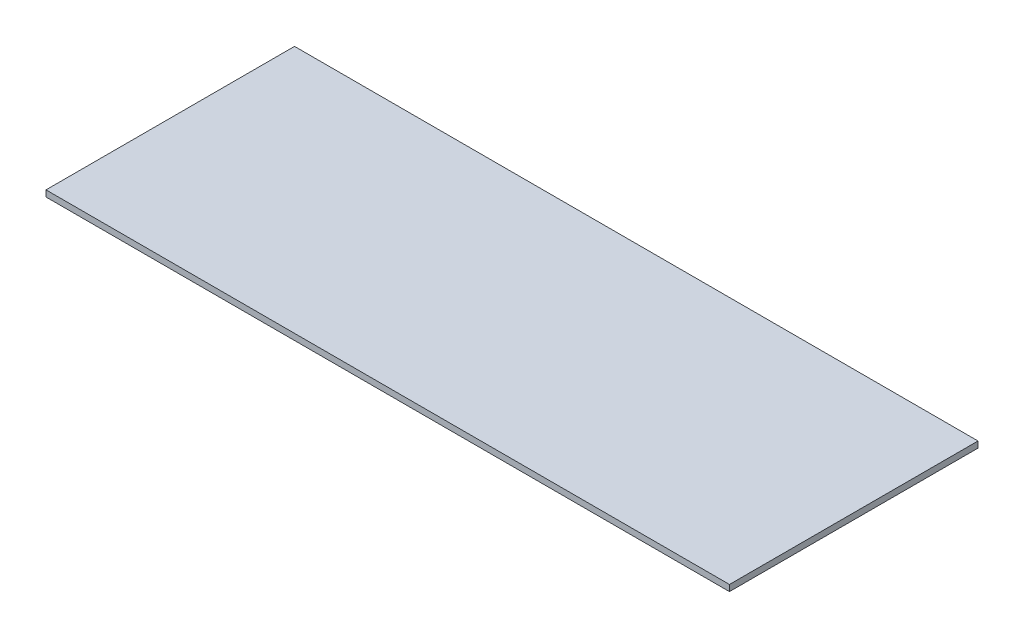
ISO-10303-21;
HEADER;
FILE_DESCRIPTION(('STEP AP214'),'2;1');
FILE_NAME('part.step','',(''),(''),'','','');
FILE_SCHEMA(('AUTOMOTIVE_DESIGN { 1 0 10303 214 1 1 1 1 }'));
ENDSEC;
DATA;
#1=APPLICATION_CONTEXT('core data for automotive mechanical design processes');
#2=APPLICATION_PROTOCOL_DEFINITION('international standard','automotive_design',2000,#1);
#3=PRODUCT_CONTEXT('',#1,'mechanical');
#4=PRODUCT('Part','Part','',(#3));
#5=PRODUCT_RELATED_PRODUCT_CATEGORY('part','',(#4));
#6=PRODUCT_DEFINITION_FORMATION('','',#4);
#7=PRODUCT_DEFINITION_CONTEXT('part definition',#1,'design');
#8=PRODUCT_DEFINITION('design','',#6,#7);
#9=PRODUCT_DEFINITION_SHAPE('','',#8);
#10=(LENGTH_UNIT() NAMED_UNIT(*) SI_UNIT(.MILLI.,.METRE.));
#11=(NAMED_UNIT(*) PLANE_ANGLE_UNIT() SI_UNIT($,.RADIAN.));
#12=(NAMED_UNIT(*) SI_UNIT($,.STERADIAN.) SOLID_ANGLE_UNIT());
#13=UNCERTAINTY_MEASURE_WITH_UNIT(LENGTH_MEASURE(1.E-05),#10,'distance_accuracy_value','');
#14=(GEOMETRIC_REPRESENTATION_CONTEXT(3) GLOBAL_UNCERTAINTY_ASSIGNED_CONTEXT((#13)) GLOBAL_UNIT_ASSIGNED_CONTEXT((#10,
#11,#12)) REPRESENTATION_CONTEXT('',''));
#15=CARTESIAN_POINT('',(0.,0.,0.));
#16=DIRECTION('',(0.,0.,1.));
#17=DIRECTION('',(1.,0.,0.));
#18=AXIS2_PLACEMENT_3D('',#15,#16,#17);
#19=CARTESIAN_POINT('',(0.,1.27,0.));
#20=DIRECTION('',(1.,0.,0.));
#21=DIRECTION('',(0.,0.,-1.));
#22=AXIS2_PLACEMENT_3D('',#19,#20,#21);
#23=PLANE('',#22);
#24=DIRECTION('',(0.,0.,1.));
#25=VECTOR('',#24,1.);
#26=CARTESIAN_POINT('',(0.,0.,0.));
#27=LINE('',#26,#25);
#28=CARTESIAN_POINT('',(0.,0.,-50.8));
#29=VERTEX_POINT('',#28);
#30=CARTESIAN_POINT('',(0.,0.,0.));
#31=VERTEX_POINT('',#30);
#32=EDGE_CURVE('E96',#29,#31,#27,.T.);
#33=ORIENTED_EDGE('',*,*,#32,.T.);
#34=DIRECTION('',(0.,-1.,0.));
#35=VECTOR('',#34,1.);
#36=CARTESIAN_POINT('',(0.,1.27,0.));
#37=LINE('',#36,#35);
#38=CARTESIAN_POINT('',(0.,1.27,0.));
#39=VERTEX_POINT('',#38);
#40=EDGE_CURVE('E11',#39,#31,#37,.T.);
#41=ORIENTED_EDGE('',*,*,#40,.F.);
#42=DIRECTION('',(0.,0.,1.));
#43=VECTOR('',#42,1.);
#44=CARTESIAN_POINT('',(0.,1.27,0.));
#45=LINE('',#44,#43);
#46=CARTESIAN_POINT('',(0.,1.27,-50.8));
#47=VERTEX_POINT('',#46);
#48=EDGE_CURVE('E84',#47,#39,#45,.T.);
#49=ORIENTED_EDGE('',*,*,#48,.F.);
#50=DIRECTION('',(0.,-1.,0.));
#51=VECTOR('',#50,1.);
#52=CARTESIAN_POINT('',(0.,1.27,-50.8));
#53=LINE('',#52,#51);
#54=EDGE_CURVE('E92',#47,#29,#53,.T.);
#55=ORIENTED_EDGE('',*,*,#54,.T.);
#56=EDGE_LOOP('',(#33,#41,#49,#55));
#57=FACE_BOUND('',#56,.T.);
#58=ADVANCED_FACE('F33',(#57),#23,.F.);
#59=CARTESIAN_POINT('',(0.,1.27,0.));
#60=DIRECTION('',(0.,0.,-1.));
#61=DIRECTION('',(-1.,0.,0.));
#62=AXIS2_PLACEMENT_3D('',#59,#60,#61);
#63=PLANE('',#62);
#64=DIRECTION('',(1.,0.,0.));
#65=VECTOR('',#64,1.);
#66=CARTESIAN_POINT('',(0.,0.,0.));
#67=LINE('',#66,#65);
#68=CARTESIAN_POINT('',(139.7,0.,0.));
#69=VERTEX_POINT('',#68);
#70=EDGE_CURVE('E88',#31,#69,#67,.T.);
#71=ORIENTED_EDGE('',*,*,#70,.T.);
#72=DIRECTION('',(0.,-1.,0.));
#73=VECTOR('',#72,1.);
#74=CARTESIAN_POINT('',(139.7,1.27,0.));
#75=LINE('',#74,#73);
#76=CARTESIAN_POINT('',(139.7,1.27,0.));
#77=VERTEX_POINT('',#76);
#78=EDGE_CURVE('E41',#77,#69,#75,.T.);
#79=ORIENTED_EDGE('',*,*,#78,.F.);
#80=DIRECTION('',(1.,0.,0.));
#81=VECTOR('',#80,1.);
#82=CARTESIAN_POINT('',(0.,1.27,0.));
#83=LINE('',#82,#81);
#84=EDGE_CURVE('E79',#39,#77,#83,.T.);
#85=ORIENTED_EDGE('',*,*,#84,.F.);
#86=ORIENTED_EDGE('',*,*,#40,.T.);
#87=EDGE_LOOP('',(#71,#79,#85,#86));
#88=FACE_BOUND('',#87,.T.);
#89=ADVANCED_FACE('F87',(#88),#63,.F.);
#90=CARTESIAN_POINT('',(139.7,1.27,0.));
#91=DIRECTION('',(-1.,0.,0.));
#92=DIRECTION('',(0.,0.,1.));
#93=AXIS2_PLACEMENT_3D('',#90,#91,#92);
#94=PLANE('',#93);
#95=DIRECTION('',(0.,0.,-1.));
#96=VECTOR('',#95,1.);
#97=CARTESIAN_POINT('',(139.7,0.,0.));
#98=LINE('',#97,#96);
#99=CARTESIAN_POINT('',(139.7,0.,-50.8));
#100=VERTEX_POINT('',#99);
#101=EDGE_CURVE('E66',#69,#100,#98,.T.);
#102=ORIENTED_EDGE('',*,*,#101,.T.);
#103=DIRECTION('',(0.,-1.,0.));
#104=VECTOR('',#103,1.);
#105=CARTESIAN_POINT('',(139.7,1.27,-50.8));
#106=LINE('',#105,#104);
#107=CARTESIAN_POINT('',(139.7,1.27,-50.8));
#108=VERTEX_POINT('',#107);
#109=EDGE_CURVE('E89',#108,#100,#106,.T.);
#110=ORIENTED_EDGE('',*,*,#109,.F.);
#111=DIRECTION('',(0.,0.,-1.));
#112=VECTOR('',#111,1.);
#113=CARTESIAN_POINT('',(139.7,1.27,0.));
#114=LINE('',#113,#112);
#115=EDGE_CURVE('E82',#77,#108,#114,.T.);
#116=ORIENTED_EDGE('',*,*,#115,.F.);
#117=ORIENTED_EDGE('',*,*,#78,.T.);
#118=EDGE_LOOP('',(#102,#110,#116,#117));
#119=FACE_BOUND('',#118,.T.);
#120=ADVANCED_FACE('F90',(#119),#94,.F.);
#121=CARTESIAN_POINT('',(0.,1.27,-50.8));
#122=DIRECTION('',(0.,0.,1.));
#123=DIRECTION('',(1.,0.,0.));
#124=AXIS2_PLACEMENT_3D('',#121,#122,#123);
#125=PLANE('',#124);
#126=DIRECTION('',(-1.,0.,0.));
#127=VECTOR('',#126,1.);
#128=CARTESIAN_POINT('',(0.,0.,-50.8));
#129=LINE('',#128,#127);
#130=EDGE_CURVE('E72',#100,#29,#129,.T.);
#131=ORIENTED_EDGE('',*,*,#130,.T.);
#132=ORIENTED_EDGE('',*,*,#54,.F.);
#133=DIRECTION('',(-1.,0.,0.));
#134=VECTOR('',#133,1.);
#135=CARTESIAN_POINT('',(0.,1.27,-50.8));
#136=LINE('',#135,#134);
#137=EDGE_CURVE('E49',#108,#47,#136,.T.);
#138=ORIENTED_EDGE('',*,*,#137,.F.);
#139=ORIENTED_EDGE('',*,*,#109,.T.);
#140=EDGE_LOOP('',(#131,#132,#138,#139));
#141=FACE_BOUND('',#140,.T.);
#142=ADVANCED_FACE('F103',(#141),#125,.F.);
#143=CARTESIAN_POINT('',(0.,1.27,0.));
#144=DIRECTION('',(0.,-1.,0.));
#145=DIRECTION('',(0.,0.,-1.));
#146=AXIS2_PLACEMENT_3D('',#143,#144,#145);
#147=PLANE('',#146);
#148=ORIENTED_EDGE('',*,*,#48,.T.);
#149=ORIENTED_EDGE('',*,*,#84,.T.);
#150=ORIENTED_EDGE('',*,*,#115,.T.);
#151=ORIENTED_EDGE('',*,*,#137,.T.);
#152=EDGE_LOOP('',(#148,#149,#150,#151));
#153=FACE_BOUND('',#152,.T.);
#154=ADVANCED_FACE('F80',(#153),#147,.F.);
#155=CARTESIAN_POINT('',(0.,0.,0.));
#156=DIRECTION('',(0.,-1.,0.));
#157=DIRECTION('',(0.,0.,-1.));
#158=AXIS2_PLACEMENT_3D('',#155,#156,#157);
#159=PLANE('',#158);
#160=ORIENTED_EDGE('',*,*,#32,.F.);
#161=ORIENTED_EDGE('',*,*,#130,.F.);
#162=ORIENTED_EDGE('',*,*,#101,.F.);
#163=ORIENTED_EDGE('',*,*,#70,.F.);
#164=EDGE_LOOP('',(#160,#161,#162,#163));
#165=FACE_BOUND('',#164,.T.);
#166=ADVANCED_FACE('F106',(#165),#159,.T.);
#167=CLOSED_SHELL('',(#58,#89,#120,#142,#154,#166));
#168=MANIFOLD_SOLID_BREP('B2',#167);
#169=ADVANCED_BREP_SHAPE_REPRESENTATION('',(#18,#168),#14);
#170=SHAPE_DEFINITION_REPRESENTATION(#9,#169);
ENDSEC;
END-ISO-10303-21;
